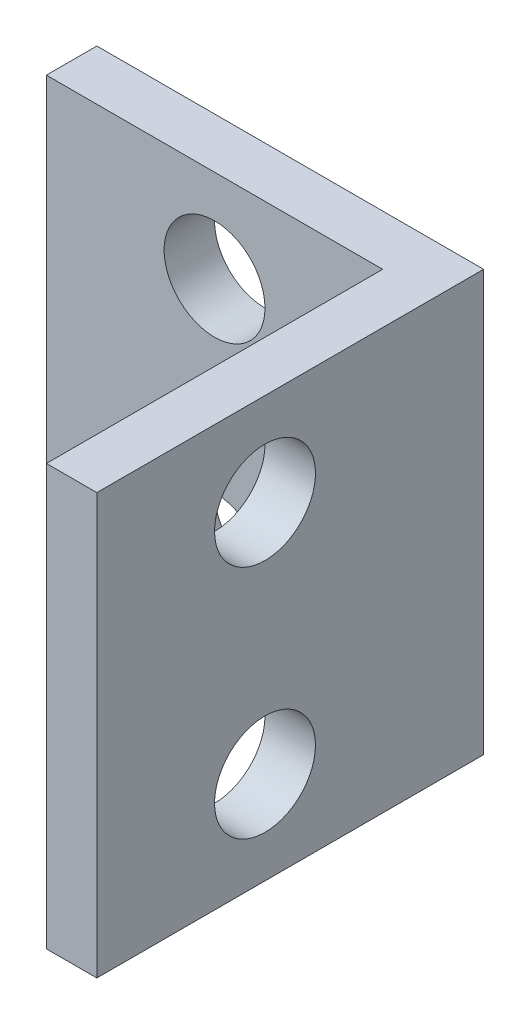
ISO-10303-21;
HEADER;
FILE_DESCRIPTION(('STEP AP214'),'2;1');
FILE_NAME('part.step','',(''),(''),'','','');
FILE_SCHEMA(('AUTOMOTIVE_DESIGN { 1 0 10303 214 1 1 1 1 }'));
ENDSEC;
DATA;
#1=APPLICATION_CONTEXT('core data for automotive mechanical design processes');
#2=APPLICATION_PROTOCOL_DEFINITION('international standard','automotive_design',2000,#1);
#3=PRODUCT_CONTEXT('',#1,'mechanical');
#4=PRODUCT('Part','Part','',(#3));
#5=PRODUCT_RELATED_PRODUCT_CATEGORY('part','',(#4));
#6=PRODUCT_DEFINITION_FORMATION('','',#4);
#7=PRODUCT_DEFINITION_CONTEXT('part definition',#1,'design');
#8=PRODUCT_DEFINITION('design','',#6,#7);
#9=PRODUCT_DEFINITION_SHAPE('','',#8);
#10=(LENGTH_UNIT() NAMED_UNIT(*) SI_UNIT(.MILLI.,.METRE.));
#11=(NAMED_UNIT(*) PLANE_ANGLE_UNIT() SI_UNIT($,.RADIAN.));
#12=(NAMED_UNIT(*) SI_UNIT($,.STERADIAN.) SOLID_ANGLE_UNIT());
#13=UNCERTAINTY_MEASURE_WITH_UNIT(LENGTH_MEASURE(1.E-05),#10,'distance_accuracy_value','');
#14=(GEOMETRIC_REPRESENTATION_CONTEXT(3) GLOBAL_UNCERTAINTY_ASSIGNED_CONTEXT((#13)) GLOBAL_UNIT_ASSIGNED_CONTEXT((#10,
#11,#12)) REPRESENTATION_CONTEXT('',''));
#15=CARTESIAN_POINT('',(0.,0.,0.));
#16=DIRECTION('',(0.,0.,1.));
#17=DIRECTION('',(1.,0.,0.));
#18=AXIS2_PLACEMENT_3D('',#15,#16,#17);
#19=CARTESIAN_POINT('',(-10.,12.5,3.));
#20=DIRECTION('',(0.,-1.,0.));
#21=DIRECTION('',(0.,0.,-1.));
#22=AXIS2_PLACEMENT_3D('',#19,#20,#21);
#23=PLANE('',#22);
#24=DIRECTION('',(-1.,0.,0.));
#25=VECTOR('',#24,1.);
#26=CARTESIAN_POINT('',(-10.,12.5,0.));
#27=LINE('',#26,#25);
#28=CARTESIAN_POINT('',(13.,12.5,0.));
#29=VERTEX_POINT('',#28);
#30=CARTESIAN_POINT('',(-10.,12.5,0.));
#31=VERTEX_POINT('',#30);
#32=EDGE_CURVE('E64',#29,#31,#27,.T.);
#33=ORIENTED_EDGE('',*,*,#32,.T.);
#34=DIRECTION('',(0.,0.,-1.));
#35=VECTOR('',#34,1.);
#36=CARTESIAN_POINT('',(-10.,12.5,3.));
#37=LINE('',#36,#35);
#38=CARTESIAN_POINT('',(-10.,12.5,3.));
#39=VERTEX_POINT('',#38);
#40=EDGE_CURVE('E11',#39,#31,#37,.T.);
#41=ORIENTED_EDGE('',*,*,#40,.F.);
#42=DIRECTION('',(-1.,0.,0.));
#43=VECTOR('',#42,1.);
#44=CARTESIAN_POINT('',(-10.,12.5,3.));
#45=LINE('',#44,#43);
#46=CARTESIAN_POINT('',(10.,12.5,3.));
#47=VERTEX_POINT('',#46);
#48=EDGE_CURVE('E93',#47,#39,#45,.T.);
#49=ORIENTED_EDGE('',*,*,#48,.F.);
#50=DIRECTION('',(0.,0.,1.));
#51=VECTOR('',#50,1.);
#52=CARTESIAN_POINT('',(10.,12.5,0.));
#53=LINE('',#52,#51);
#54=CARTESIAN_POINT('',(10.,12.5,23.));
#55=VERTEX_POINT('',#54);
#56=EDGE_CURVE('E83',#47,#55,#53,.T.);
#57=ORIENTED_EDGE('',*,*,#56,.T.);
#58=DIRECTION('',(-1.,0.,0.));
#59=VECTOR('',#58,1.);
#60=CARTESIAN_POINT('',(13.,12.5,23.));
#61=LINE('',#60,#59);
#62=CARTESIAN_POINT('',(13.,12.5,23.));
#63=VERTEX_POINT('',#62);
#64=EDGE_CURVE('E103',#63,#55,#61,.T.);
#65=ORIENTED_EDGE('',*,*,#64,.F.);
#66=DIRECTION('',(0.,0.,1.));
#67=VECTOR('',#66,1.);
#68=CARTESIAN_POINT('',(13.,12.5,0.));
#69=LINE('',#68,#67);
#70=EDGE_CURVE('E125',#29,#63,#69,.T.);
#71=ORIENTED_EDGE('',*,*,#70,.F.);
#72=EDGE_LOOP('',(#33,#41,#49,#57,#65,#71));
#73=FACE_BOUND('',#72,.T.);
#74=ADVANCED_FACE('F36',(#73),#23,.F.);
#75=CARTESIAN_POINT('',(-10.,-12.5,3.));
#76=DIRECTION('',(1.,0.,0.));
#77=DIRECTION('',(0.,0.,-1.));
#78=AXIS2_PLACEMENT_3D('',#75,#76,#77);
#79=PLANE('',#78);
#80=DIRECTION('',(0.,-1.,0.));
#81=VECTOR('',#80,1.);
#82=CARTESIAN_POINT('',(-10.,-12.5,0.));
#83=LINE('',#82,#81);
#84=CARTESIAN_POINT('',(-10.,-12.5,0.));
#85=VERTEX_POINT('',#84);
#86=EDGE_CURVE('E100',#31,#85,#83,.T.);
#87=ORIENTED_EDGE('',*,*,#86,.T.);
#88=DIRECTION('',(0.,0.,-1.));
#89=VECTOR('',#88,1.);
#90=CARTESIAN_POINT('',(-10.,-12.5,3.));
#91=LINE('',#90,#89);
#92=CARTESIAN_POINT('',(-10.,-12.5,3.));
#93=VERTEX_POINT('',#92);
#94=EDGE_CURVE('E44',#93,#85,#91,.T.);
#95=ORIENTED_EDGE('',*,*,#94,.F.);
#96=DIRECTION('',(0.,-1.,0.));
#97=VECTOR('',#96,1.);
#98=CARTESIAN_POINT('',(-10.,-12.5,3.));
#99=LINE('',#98,#97);
#100=EDGE_CURVE('E52',#39,#93,#99,.T.);
#101=ORIENTED_EDGE('',*,*,#100,.F.);
#102=ORIENTED_EDGE('',*,*,#40,.T.);
#103=EDGE_LOOP('',(#87,#95,#101,#102));
#104=FACE_BOUND('',#103,.T.);
#105=ADVANCED_FACE('F166',(#104),#79,.F.);
#106=CARTESIAN_POINT('',(-10.,-12.5,3.));
#107=DIRECTION('',(0.,1.,0.));
#108=DIRECTION('',(0.,0.,1.));
#109=AXIS2_PLACEMENT_3D('',#106,#107,#108);
#110=PLANE('',#109);
#111=DIRECTION('',(1.,0.,0.));
#112=VECTOR('',#111,1.);
#113=CARTESIAN_POINT('',(-10.,-12.5,0.));
#114=LINE('',#113,#112);
#115=CARTESIAN_POINT('',(13.,-12.5,0.));
#116=VERTEX_POINT('',#115);
#117=EDGE_CURVE('E98',#85,#116,#114,.T.);
#118=ORIENTED_EDGE('',*,*,#117,.T.);
#119=DIRECTION('',(0.,0.,-1.));
#120=VECTOR('',#119,1.);
#121=CARTESIAN_POINT('',(13.,-12.5,0.));
#122=LINE('',#121,#120);
#123=CARTESIAN_POINT('',(13.,-12.5,23.));
#124=VERTEX_POINT('',#123);
#125=EDGE_CURVE('E137',#124,#116,#122,.T.);
#126=ORIENTED_EDGE('',*,*,#125,.F.);
#127=DIRECTION('',(-1.,0.,0.));
#128=VECTOR('',#127,1.);
#129=CARTESIAN_POINT('',(13.,-12.5,23.));
#130=LINE('',#129,#128);
#131=CARTESIAN_POINT('',(10.,-12.5,23.));
#132=VERTEX_POINT('',#131);
#133=EDGE_CURVE('E138',#124,#132,#130,.T.);
#134=ORIENTED_EDGE('',*,*,#133,.T.);
#135=DIRECTION('',(0.,0.,-1.));
#136=VECTOR('',#135,1.);
#137=CARTESIAN_POINT('',(10.,-12.5,0.));
#138=LINE('',#137,#136);
#139=CARTESIAN_POINT('',(10.,-12.5,3.));
#140=VERTEX_POINT('',#139);
#141=EDGE_CURVE('E126',#132,#140,#138,.T.);
#142=ORIENTED_EDGE('',*,*,#141,.T.);
#143=DIRECTION('',(1.,0.,0.));
#144=VECTOR('',#143,1.);
#145=CARTESIAN_POINT('',(-10.,-12.5,3.));
#146=LINE('',#145,#144);
#147=EDGE_CURVE('E97',#93,#140,#146,.T.);
#148=ORIENTED_EDGE('',*,*,#147,.F.);
#149=ORIENTED_EDGE('',*,*,#94,.T.);
#150=EDGE_LOOP('',(#118,#126,#134,#142,#148,#149));
#151=FACE_BOUND('',#150,.T.);
#152=ADVANCED_FACE('F112',(#151),#110,.F.);
#153=CARTESIAN_POINT('',(0.,0.,3.));
#154=DIRECTION('',(0.,0.,-1.));
#155=DIRECTION('',(-1.,0.,0.));
#156=AXIS2_PLACEMENT_3D('',#153,#154,#155);
#157=PLANE('',#156);
#158=CARTESIAN_POINT('',(0.,7.,3.));
#159=DIRECTION('',(0.,0.,1.));
#160=DIRECTION('',(1.,0.,0.));
#161=AXIS2_PLACEMENT_3D('',#158,#159,#160);
#162=CIRCLE('',#161,3.);
#163=CARTESIAN_POINT('',(3.,7.,3.));
#164=VERTEX_POINT('',#163);
#165=EDGE_CURVE('E200',#164,#164,#162,.T.);
#166=ORIENTED_EDGE('',*,*,#165,.F.);
#167=EDGE_LOOP('',(#166));
#168=FACE_BOUND('',#167,.T.);
#169=CARTESIAN_POINT('',(0.,-7.,3.));
#170=DIRECTION('',(0.,0.,1.));
#171=DIRECTION('',(-1.,0.,0.));
#172=AXIS2_PLACEMENT_3D('',#169,#170,#171);
#173=CIRCLE('',#172,3.);
#174=CARTESIAN_POINT('',(-3.,-7.,3.));
#175=VERTEX_POINT('',#174);
#176=EDGE_CURVE('E132',#175,#175,#173,.T.);
#177=ORIENTED_EDGE('',*,*,#176,.F.);
#178=EDGE_LOOP('',(#177));
#179=FACE_BOUND('',#178,.T.);
#180=DIRECTION('',(0.,1.,0.));
#181=VECTOR('',#180,1.);
#182=CARTESIAN_POINT('',(10.,-12.5,3.));
#183=LINE('',#182,#181);
#184=EDGE_CURVE('E73',#140,#47,#183,.T.);
#185=ORIENTED_EDGE('',*,*,#184,.T.);
#186=ORIENTED_EDGE('',*,*,#48,.T.);
#187=ORIENTED_EDGE('',*,*,#100,.T.);
#188=ORIENTED_EDGE('',*,*,#147,.T.);
#189=EDGE_LOOP('',(#185,#186,#187,#188));
#190=FACE_BOUND('',#189,.T.);
#191=ADVANCED_FACE('F95',(#168,#179,#190),#157,.F.);
#192=CARTESIAN_POINT('',(0.,0.,0.));
#193=DIRECTION('',(0.,0.,-1.));
#194=DIRECTION('',(-1.,0.,0.));
#195=AXIS2_PLACEMENT_3D('',#192,#193,#194);
#196=PLANE('',#195);
#197=CARTESIAN_POINT('',(0.,7.,0.));
#198=DIRECTION('',(0.,0.,1.));
#199=DIRECTION('',(1.,0.,0.));
#200=AXIS2_PLACEMENT_3D('',#197,#198,#199);
#201=CIRCLE('',#200,3.);
#202=CARTESIAN_POINT('',(3.,7.,0.));
#203=VERTEX_POINT('',#202);
#204=EDGE_CURVE('E91',#203,#203,#201,.T.);
#205=ORIENTED_EDGE('',*,*,#204,.T.);
#206=EDGE_LOOP('',(#205));
#207=FACE_BOUND('',#206,.T.);
#208=CARTESIAN_POINT('',(0.,-7.,0.));
#209=DIRECTION('',(0.,0.,1.));
#210=DIRECTION('',(-1.,0.,0.));
#211=AXIS2_PLACEMENT_3D('',#208,#209,#210);
#212=CIRCLE('',#211,3.);
#213=CARTESIAN_POINT('',(-3.,-7.,0.));
#214=VERTEX_POINT('',#213);
#215=EDGE_CURVE('E202',#214,#214,#212,.T.);
#216=ORIENTED_EDGE('',*,*,#215,.T.);
#217=EDGE_LOOP('',(#216));
#218=FACE_BOUND('',#217,.T.);
#219=ORIENTED_EDGE('',*,*,#32,.F.);
#220=DIRECTION('',(0.,1.,0.));
#221=VECTOR('',#220,1.);
#222=CARTESIAN_POINT('',(13.,12.5,0.));
#223=LINE('',#222,#221);
#224=EDGE_CURVE('E121',#116,#29,#223,.T.);
#225=ORIENTED_EDGE('',*,*,#224,.F.);
#226=ORIENTED_EDGE('',*,*,#117,.F.);
#227=ORIENTED_EDGE('',*,*,#86,.F.);
#228=EDGE_LOOP('',(#219,#225,#226,#227));
#229=FACE_BOUND('',#228,.T.);
#230=ADVANCED_FACE('F119',(#207,#218,#229),#196,.T.);
#231=CARTESIAN_POINT('',(10.,0.,0.));
#232=DIRECTION('',(-1.,0.,0.));
#233=DIRECTION('',(0.,0.,1.));
#234=AXIS2_PLACEMENT_3D('',#231,#232,#233);
#235=PLANE('',#234);
#236=CARTESIAN_POINT('',(10.,7.,13.));
#237=DIRECTION('',(-1.,0.,0.));
#238=DIRECTION('',(0.,0.,1.));
#239=AXIS2_PLACEMENT_3D('',#236,#237,#238);
#240=CIRCLE('',#239,3.);
#241=CARTESIAN_POINT('',(10.,7.,16.));
#242=VERTEX_POINT('',#241);
#243=EDGE_CURVE('E187',#242,#242,#240,.T.);
#244=ORIENTED_EDGE('',*,*,#243,.F.);
#245=EDGE_LOOP('',(#244));
#246=FACE_BOUND('',#245,.T.);
#247=CARTESIAN_POINT('',(10.,-7.,13.));
#248=DIRECTION('',(-1.,0.,0.));
#249=DIRECTION('',(0.,0.,-1.));
#250=AXIS2_PLACEMENT_3D('',#247,#248,#249);
#251=CIRCLE('',#250,3.);
#252=CARTESIAN_POINT('',(10.,-7.,10.));
#253=VERTEX_POINT('',#252);
#254=EDGE_CURVE('E190',#253,#253,#251,.T.);
#255=ORIENTED_EDGE('',*,*,#254,.F.);
#256=EDGE_LOOP('',(#255));
#257=FACE_BOUND('',#256,.T.);
#258=ORIENTED_EDGE('',*,*,#184,.F.);
#259=ORIENTED_EDGE('',*,*,#141,.F.);
#260=DIRECTION('',(0.,-1.,0.));
#261=VECTOR('',#260,1.);
#262=CARTESIAN_POINT('',(10.,12.5,23.));
#263=LINE('',#262,#261);
#264=EDGE_CURVE('E88',#55,#132,#263,.T.);
#265=ORIENTED_EDGE('',*,*,#264,.F.);
#266=ORIENTED_EDGE('',*,*,#56,.F.);
#267=EDGE_LOOP('',(#258,#259,#265,#266));
#268=FACE_BOUND('',#267,.T.);
#269=ADVANCED_FACE('F85',(#246,#257,#268),#235,.T.);
#270=CARTESIAN_POINT('',(13.,12.5,23.));
#271=DIRECTION('',(0.,0.,-1.));
#272=DIRECTION('',(0.,1.,0.));
#273=AXIS2_PLACEMENT_3D('',#270,#271,#272);
#274=PLANE('',#273);
#275=ORIENTED_EDGE('',*,*,#264,.T.);
#276=ORIENTED_EDGE('',*,*,#133,.F.);
#277=DIRECTION('',(0.,-1.,0.));
#278=VECTOR('',#277,1.);
#279=CARTESIAN_POINT('',(13.,12.5,23.));
#280=LINE('',#279,#278);
#281=EDGE_CURVE('E128',#63,#124,#280,.T.);
#282=ORIENTED_EDGE('',*,*,#281,.F.);
#283=ORIENTED_EDGE('',*,*,#64,.T.);
#284=EDGE_LOOP('',(#275,#276,#282,#283));
#285=FACE_BOUND('',#284,.T.);
#286=ADVANCED_FACE('F144',(#285),#274,.F.);
#287=CARTESIAN_POINT('',(13.,0.,0.));
#288=DIRECTION('',(-1.,0.,0.));
#289=DIRECTION('',(0.,0.,1.));
#290=AXIS2_PLACEMENT_3D('',#287,#288,#289);
#291=PLANE('',#290);
#292=CARTESIAN_POINT('',(13.,7.,13.));
#293=DIRECTION('',(-1.,0.,0.));
#294=DIRECTION('',(0.,0.,1.));
#295=AXIS2_PLACEMENT_3D('',#292,#293,#294);
#296=CIRCLE('',#295,3.);
#297=CARTESIAN_POINT('',(13.,7.,16.));
#298=VERTEX_POINT('',#297);
#299=EDGE_CURVE('E207',#298,#298,#296,.T.);
#300=ORIENTED_EDGE('',*,*,#299,.T.);
#301=EDGE_LOOP('',(#300));
#302=FACE_BOUND('',#301,.T.);
#303=CARTESIAN_POINT('',(13.,-7.,13.));
#304=DIRECTION('',(-1.,0.,0.));
#305=DIRECTION('',(0.,0.,-1.));
#306=AXIS2_PLACEMENT_3D('',#303,#304,#305);
#307=CIRCLE('',#306,3.);
#308=CARTESIAN_POINT('',(13.,-7.,10.));
#309=VERTEX_POINT('',#308);
#310=EDGE_CURVE('E192',#309,#309,#307,.T.);
#311=ORIENTED_EDGE('',*,*,#310,.T.);
#312=EDGE_LOOP('',(#311));
#313=FACE_BOUND('',#312,.T.);
#314=ORIENTED_EDGE('',*,*,#224,.T.);
#315=ORIENTED_EDGE('',*,*,#70,.T.);
#316=ORIENTED_EDGE('',*,*,#281,.T.);
#317=ORIENTED_EDGE('',*,*,#125,.T.);
#318=EDGE_LOOP('',(#314,#315,#316,#317));
#319=FACE_BOUND('',#318,.T.);
#320=ADVANCED_FACE('F149',(#302,#313,#319),#291,.F.);
#321=CARTESIAN_POINT('',(0.,-7.,0.));
#322=DIRECTION('',(0.,0.,1.));
#323=DIRECTION('',(1.,0.,0.));
#324=AXIS2_PLACEMENT_3D('',#321,#322,#323);
#325=CYLINDRICAL_SURFACE('',#324,3.);
#326=ORIENTED_EDGE('',*,*,#215,.F.);
#327=EDGE_LOOP('',(#326));
#328=FACE_BOUND('',#327,.T.);
#329=ORIENTED_EDGE('',*,*,#176,.T.);
#330=EDGE_LOOP('',(#329));
#331=FACE_BOUND('',#330,.T.);
#332=ADVANCED_FACE('F151',(#328,#331),#325,.F.);
#333=CARTESIAN_POINT('',(0.,7.,0.));
#334=DIRECTION('',(0.,0.,1.));
#335=DIRECTION('',(1.,0.,0.));
#336=AXIS2_PLACEMENT_3D('',#333,#334,#335);
#337=CYLINDRICAL_SURFACE('',#336,3.);
#338=ORIENTED_EDGE('',*,*,#204,.F.);
#339=EDGE_LOOP('',(#338));
#340=FACE_BOUND('',#339,.T.);
#341=ORIENTED_EDGE('',*,*,#165,.T.);
#342=EDGE_LOOP('',(#341));
#343=FACE_BOUND('',#342,.T.);
#344=ADVANCED_FACE('F158',(#340,#343),#337,.F.);
#345=CARTESIAN_POINT('',(13.,-7.,13.));
#346=DIRECTION('',(-1.,0.,0.));
#347=DIRECTION('',(0.,0.,1.));
#348=AXIS2_PLACEMENT_3D('',#345,#346,#347);
#349=CYLINDRICAL_SURFACE('',#348,3.);
#350=ORIENTED_EDGE('',*,*,#310,.F.);
#351=EDGE_LOOP('',(#350));
#352=FACE_BOUND('',#351,.T.);
#353=ORIENTED_EDGE('',*,*,#254,.T.);
#354=EDGE_LOOP('',(#353));
#355=FACE_BOUND('',#354,.T.);
#356=ADVANCED_FACE('F215',(#352,#355),#349,.F.);
#357=CARTESIAN_POINT('',(13.,7.,13.));
#358=DIRECTION('',(-1.,0.,0.));
#359=DIRECTION('',(0.,0.,1.));
#360=AXIS2_PLACEMENT_3D('',#357,#358,#359);
#361=CYLINDRICAL_SURFACE('',#360,3.);
#362=ORIENTED_EDGE('',*,*,#299,.F.);
#363=EDGE_LOOP('',(#362));
#364=FACE_BOUND('',#363,.T.);
#365=ORIENTED_EDGE('',*,*,#243,.T.);
#366=EDGE_LOOP('',(#365));
#367=FACE_BOUND('',#366,.T.);
#368=ADVANCED_FACE('F213',(#364,#367),#361,.F.);
#369=CLOSED_SHELL('',(#74,#105,#152,#191,#230,#269,#286,#320,#332,#344,#356,#368));
#370=MANIFOLD_SOLID_BREP('B2',#369);
#371=ADVANCED_BREP_SHAPE_REPRESENTATION('',(#18,#370),#14);
#372=SHAPE_DEFINITION_REPRESENTATION(#9,#371);
ENDSEC;
END-ISO-10303-21;
